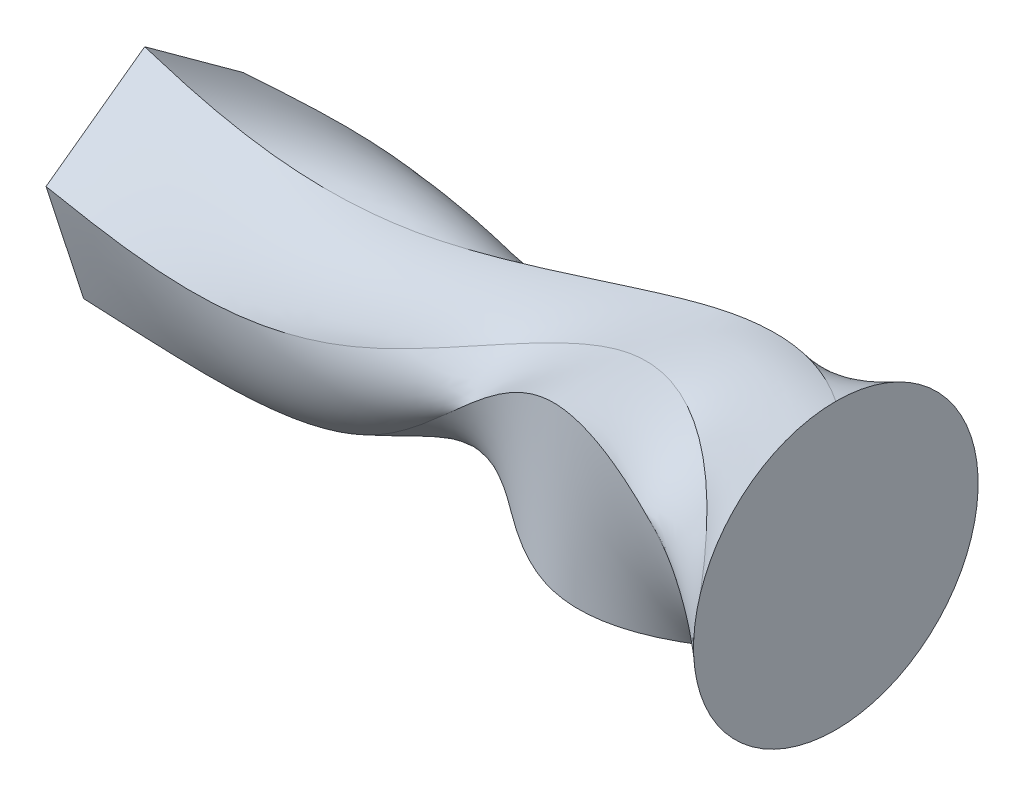
ISO-10303-21;
HEADER;
FILE_DESCRIPTION(('STEP AP214'),'2;1');
FILE_NAME('part.step','',(''),(''),'','','');
FILE_SCHEMA(('AUTOMOTIVE_DESIGN { 1 0 10303 214 1 1 1 1 }'));
ENDSEC;
DATA;
#1=APPLICATION_CONTEXT('core data for automotive mechanical design processes');
#2=APPLICATION_PROTOCOL_DEFINITION('international standard','automotive_design',2000,#1);
#3=PRODUCT_CONTEXT('',#1,'mechanical');
#4=PRODUCT('Part','Part','',(#3));
#5=PRODUCT_RELATED_PRODUCT_CATEGORY('part','',(#4));
#6=PRODUCT_DEFINITION_FORMATION('','',#4);
#7=PRODUCT_DEFINITION_CONTEXT('part definition',#1,'design');
#8=PRODUCT_DEFINITION('design','',#6,#7);
#9=PRODUCT_DEFINITION_SHAPE('','',#8);
#10=(LENGTH_UNIT() NAMED_UNIT(*) SI_UNIT(.MILLI.,.METRE.));
#11=(NAMED_UNIT(*) PLANE_ANGLE_UNIT() SI_UNIT($,.RADIAN.));
#12=(NAMED_UNIT(*) SI_UNIT($,.STERADIAN.) SOLID_ANGLE_UNIT());
#13=UNCERTAINTY_MEASURE_WITH_UNIT(LENGTH_MEASURE(1.E-05),#10,'distance_accuracy_value','');
#14=(GEOMETRIC_REPRESENTATION_CONTEXT(3) GLOBAL_UNCERTAINTY_ASSIGNED_CONTEXT((#13)) GLOBAL_UNIT_ASSIGNED_CONTEXT((#10,
#11,#12)) REPRESENTATION_CONTEXT('',''));
#15=CARTESIAN_POINT('',(0.,0.,0.));
#16=DIRECTION('',(0.,0.,1.));
#17=DIRECTION('',(1.,0.,0.));
#18=AXIS2_PLACEMENT_3D('',#15,#16,#17);
#19=CARTESIAN_POINT('',(431.8,0.,0.));
#20=DIRECTION('',(1.,0.,0.));
#21=DIRECTION('',(0.,0.,-1.));
#22=AXIS2_PLACEMENT_3D('',#19,#20,#21);
#23=PLANE('',#22);
#24=CARTESIAN_POINT('',(431.8,0.,0.));
#25=DIRECTION('',(1.,0.,0.));
#26=DIRECTION('',(0.,0.,-1.));
#27=AXIS2_PLACEMENT_3D('',#24,#25,#26);
#28=CIRCLE('',#27,88.9);
#29=CARTESIAN_POINT('',(431.8,-71.9216107999328,52.2541089288009));
#30=VERTEX_POINT('',#29);
#31=CARTESIAN_POINT('',(431.8,-71.9216107999328,-52.2541089288008));
#32=VERTEX_POINT('',#31);
#33=EDGE_CURVE('E12',#30,#32,#28,.T.);
#34=ORIENTED_EDGE('',*,*,#33,.T.);
#35=CARTESIAN_POINT('',(431.8,27.4716107999328,-84.5489242986392));
#36=VERTEX_POINT('',#35);
#37=EDGE_CURVE('E80',#32,#36,#28,.T.);
#38=ORIENTED_EDGE('',*,*,#37,.T.);
#39=CARTESIAN_POINT('',(431.8,88.9,0.));
#40=VERTEX_POINT('',#39);
#41=EDGE_CURVE('E310',#36,#40,#28,.T.);
#42=ORIENTED_EDGE('',*,*,#41,.T.);
#43=CARTESIAN_POINT('',(431.8,27.4716107999328,84.5489242986392));
#44=VERTEX_POINT('',#43);
#45=EDGE_CURVE('E148',#40,#44,#28,.T.);
#46=ORIENTED_EDGE('',*,*,#45,.T.);
#47=EDGE_CURVE('E300',#44,#30,#28,.T.);
#48=ORIENTED_EDGE('',*,*,#47,.T.);
#49=EDGE_LOOP('',(#34,#38,#42,#46,#48));
#50=FACE_BOUND('',#49,.T.);
#51=ADVANCED_FACE('F70',(#50),#23,.T.);
#52=CARTESIAN_POINT('',(0.,0.,0.));
#53=DIRECTION('',(1.,0.,0.));
#54=DIRECTION('',(0.,0.,-1.));
#55=AXIS2_PLACEMENT_3D('',#52,#53,#54);
#56=PLANE('',#55);
#57=DIRECTION('',(0.,0.587785252292473,0.809016994374948));
#58=VECTOR('',#57,1.);
#59=CARTESIAN_POINT('',(0.,20.030355371739,-61.647094971371));
#60=LINE('',#59,#58);
#61=CARTESIAN_POINT('',(0.,20.030355371739,-61.647094971371));
#62=VERTEX_POINT('',#61);
#63=CARTESIAN_POINT('',(0.,64.8195915964254,0.));
#64=VERTEX_POINT('',#63);
#65=EDGE_CURVE('E122',#62,#64,#60,.T.);
#66=ORIENTED_EDGE('',*,*,#65,.F.);
#67=DIRECTION('',(0.,0.951056516295154,-0.309016994374947));
#68=VECTOR('',#67,1.);
#69=CARTESIAN_POINT('',(0.,-52.4401511699517,-38.1));
#70=LINE('',#69,#68);
#71=CARTESIAN_POINT('',(0.,-52.4401511699517,-38.1));
#72=VERTEX_POINT('',#71);
#73=EDGE_CURVE('E247',#72,#62,#70,.T.);
#74=ORIENTED_EDGE('',*,*,#73,.F.);
#75=DIRECTION('',(0.,0.,-1.));
#76=VECTOR('',#75,1.);
#77=CARTESIAN_POINT('',(0.,-52.4401511699517,38.1));
#78=LINE('',#77,#76);
#79=CARTESIAN_POINT('',(0.,-52.4401511699517,38.1));
#80=VERTEX_POINT('',#79);
#81=EDGE_CURVE('E260',#80,#72,#78,.T.);
#82=ORIENTED_EDGE('',*,*,#81,.F.);
#83=DIRECTION('',(0.,-0.951056516295154,-0.309016994374947));
#84=VECTOR('',#83,1.);
#85=CARTESIAN_POINT('',(0.,20.030355371739,61.647094971371));
#86=LINE('',#85,#84);
#87=CARTESIAN_POINT('',(0.,20.030355371739,61.647094971371));
#88=VERTEX_POINT('',#87);
#89=EDGE_CURVE('E125',#88,#80,#86,.T.);
#90=ORIENTED_EDGE('',*,*,#89,.F.);
#91=DIRECTION('',(0.,-0.587785252292473,0.809016994374947));
#92=VECTOR('',#91,1.);
#93=CARTESIAN_POINT('',(0.,64.8195915964254,0.));
#94=LINE('',#93,#92);
#95=EDGE_CURVE('E118',#64,#88,#94,.T.);
#96=ORIENTED_EDGE('',*,*,#95,.F.);
#97=EDGE_LOOP('',(#66,#74,#82,#90,#96));
#98=FACE_BOUND('',#97,.T.);
#99=ADVANCED_FACE('F121',(#98),#56,.F.);
#100=CARTESIAN_POINT('',(0.,-52.4401511699517,-38.1));
#101=CARTESIAN_POINT('',(63.157552240822,-45.1767404083597,-48.7575966962876));
#102=CARTESIAN_POINT('',(170.43557150535,-36.6230282126755,-68.3392242639367));
#103=CARTESIAN_POINT('',(309.671415473656,-50.0605976745524,99.2944748248994));
#104=CARTESIAN_POINT('',(392.332751141102,-63.3256015046618,12.4634976771245));
#105=CARTESIAN_POINT('',(431.8,-71.9216107999328,-52.2541089288008));
#106=CARTESIAN_POINT('',(0.,-28.2833156560548,-45.9490316571237));
#107=CARTESIAN_POINT('',(62.7392988216526,-20.0171139687188,-50.7628943660321));
#108=CARTESIAN_POINT('',(170.539850739317,-21.3911295843357,-86.0364199282291));
#109=CARTESIAN_POINT('',(309.774504059735,-55.5571404338784,65.9547603601721));
#110=CARTESIAN_POINT('',(391.984307209305,-60.27072481648,-34.8587722640083));
#111=CARTESIAN_POINT('',(431.8,-49.289924538566,-83.403952728722));
#112=CARTESIAN_POINT('',(0.,-4.1264801421579,-53.7980633142473));
#113=CARTESIAN_POINT('',(62.3210454024832,5.14251247092208,-52.7681920357765));
#114=CARTESIAN_POINT('',(170.644129973283,15.0793511927085,-81.772552005885));
#115=CARTESIAN_POINT('',(309.877592645814,-73.7663371123298,19.4699404868973));
#116=CARTESIAN_POINT('',(391.635863277508,-39.7048366447819,-64.0743515624569));
#117=CARTESIAN_POINT('',(431.8,-9.14722679368276,-96.4471058859588));
#118=CARTESIAN_POINT('',(0.,20.030355371739,-61.647094971371));
#119=CARTESIAN_POINT('',(61.9027919833138,30.302138910563,-54.773489705521));
#120=CARTESIAN_POINT('',(170.74840920725,47.2758473759047,-47.2580850607923));
#121=CARTESIAN_POINT('',(309.980681231893,-89.4172798255757,-45.1218035459024));
#122=CARTESIAN_POINT('',(391.287419345711,-22.6628086243514,-68.348596116349));
#123=CARTESIAN_POINT('',(431.8,27.4716107999328,-84.5489242986392));
#124=B_SPLINE_SURFACE_WITH_KNOTS('',3,3,((#100,#101,#102,#103,#104,#105),(#106,#107,#108,#109,
#110,#111),(#112,#113,#114,#115,#116,#117),(#118,#119,#120,#121,#122,#123)),.UNSPECIFIED.,.F.,
.F.,.F.,(4,4),(4,1,1,4),(0.,1.),(0.,0.372499209937848,0.67262477173628,1.),.UNSPECIFIED.);
#125=CARTESIAN_POINT('',(0.,20.030355371739,-61.647094971371));
#126=CARTESIAN_POINT('',(61.9027919833138,30.302138910563,-54.773489705521));
#127=CARTESIAN_POINT('',(170.74840920725,47.2758473759047,-47.2580850607923));
#128=CARTESIAN_POINT('',(309.980681231893,-89.4172798255757,-45.1218035459024));
#129=CARTESIAN_POINT('',(391.287419345711,-22.6628086243514,-68.348596116349));
#130=CARTESIAN_POINT('',(431.8,27.4716107999328,-84.5489242986392));
#131=B_SPLINE_CURVE_WITH_KNOTS('',3,(#125,#126,#127,#128,#129,#130),.UNSPECIFIED.,.F.,.F.,(4,1,
1,4),(0.,0.372499209937848,0.67262477173628,1.),.UNSPECIFIED.);
#132=EDGE_CURVE('E141',#62,#36,#131,.T.);
#133=CARTESIAN_POINT('',(0.,-52.4401511699517,-38.1));
#134=CARTESIAN_POINT('',(63.157552240822,-45.1767404083597,-48.7575966962876));
#135=CARTESIAN_POINT('',(170.43557150535,-36.6230282126755,-68.3392242639367));
#136=CARTESIAN_POINT('',(309.671415473656,-50.0605976745524,99.2944748248994));
#137=CARTESIAN_POINT('',(392.332751141102,-63.3256015046618,12.4634976771245));
#138=CARTESIAN_POINT('',(431.8,-71.9216107999328,-52.2541089288008));
#139=B_SPLINE_CURVE_WITH_KNOTS('',3,(#133,#134,#135,#136,#137,#138),.UNSPECIFIED.,.F.,.F.,(4,1,
1,4),(0.,0.372499209937848,0.67262477173628,1.),.UNSPECIFIED.);
#140=EDGE_CURVE('E154',#32,#72,#139,.F.);
#141=ORIENTED_EDGE('',*,*,#73,.T.);
#142=ORIENTED_EDGE('',*,*,#132,.T.);
#143=ORIENTED_EDGE('',*,*,#37,.F.);
#144=ORIENTED_EDGE('',*,*,#140,.T.);
#145=EDGE_LOOP('',(#141,#142,#143,#144));
#146=FACE_BOUND('',#145,.T.);
#147=ADVANCED_FACE('F215',(#146),#124,.T.);
#148=CARTESIAN_POINT('',(0.,20.030355371739,-61.647094971371));
#149=CARTESIAN_POINT('',(61.9027919833138,30.302138910563,-54.773489705521));
#150=CARTESIAN_POINT('',(170.74840920725,47.2758473759047,-47.2580850607923));
#151=CARTESIAN_POINT('',(309.980681231893,-89.4172798255757,-45.1218035459024));
#152=CARTESIAN_POINT('',(391.287419345711,-22.6628086243514,-68.348596116349));
#153=CARTESIAN_POINT('',(431.8,27.4716107999328,-84.5489242986391));
#154=CARTESIAN_POINT('',(0.,34.9601007799678,-41.0980633142473));
#155=CARTESIAN_POINT('',(61.5279332254698,39.5779938186371,-33.3070421579278));
#156=CARTESIAN_POINT('',(170.844199161587,68.0599640705049,-43.2490702652751));
#157=CARTESIAN_POINT('',(310.066358377034,-56.8431004525541,-44.4369498616716));
#158=CARTESIAN_POINT('',(390.991015233462,24.3640791278072,-73.1394128120149));
#159=CARTESIAN_POINT('',(431.8,64.0904483935484,-72.6507427113194));
#160=CARTESIAN_POINT('',(0.,49.8898461881966,-20.5490316571237));
#161=CARTESIAN_POINT('',(61.1530744676259,48.8538487267111,-11.8405946103346));
#162=CARTESIAN_POINT('',(170.939989115924,74.5209509566401,-12.254621657543));
#163=CARTESIAN_POINT('',(310.152035522175,-15.6956090279637,-59.9046094907211));
#164=CARTESIAN_POINT('',(390.694611121213,59.5816808928018,-55.6809928088839));
#165=CARTESIAN_POINT('',(431.8,88.9,-38.5033244252029));
#166=CARTESIAN_POINT('',(0.,64.8195915964255,0.));
#167=CARTESIAN_POINT('',(60.778215709782,58.1297036347852,9.62585293725858));
#168=CARTESIAN_POINT('',(171.035779070261,50.8911746471628,24.0229752397162));
#169=CARTESIAN_POINT('',(310.237712667316,43.4631345597806,-78.5345722969758));
#170=CARTESIAN_POINT('',(390.398207008965,69.9897310513447,-33.8666666666667));
#171=CARTESIAN_POINT('',(431.8,88.9,0.));
#172=B_SPLINE_SURFACE_WITH_KNOTS('',3,3,((#148,#149,#150,#151,#152,#153),(#154,#155,#156,#157,
#158,#159),(#160,#161,#162,#163,#164,#165),(#166,#167,#168,#169,#170,#171)),.UNSPECIFIED.,.F.,
.F.,.F.,(4,4),(4,1,1,4),(0.,1.),(0.,0.372499209937848,0.67262477173628,1.),.UNSPECIFIED.);
#173=CARTESIAN_POINT('',(0.,64.8195915964255,0.));
#174=CARTESIAN_POINT('',(60.778215709782,58.1297036347852,9.62585293725858));
#175=CARTESIAN_POINT('',(171.035779070261,50.8911746471628,24.0229752397162));
#176=CARTESIAN_POINT('',(310.237712667316,43.4631345597806,-78.5345722969758));
#177=CARTESIAN_POINT('',(390.398207008965,69.9897310513447,-33.8666666666667));
#178=CARTESIAN_POINT('',(431.8,88.9,0.));
#179=B_SPLINE_CURVE_WITH_KNOTS('',3,(#173,#174,#175,#176,#177,#178),.UNSPECIFIED.,.F.,.F.,(4,1,
1,4),(0.,0.372499209937848,0.67262477173628,1.),.UNSPECIFIED.);
#180=EDGE_CURVE('E139',#64,#40,#179,.T.);
#181=ORIENTED_EDGE('',*,*,#65,.T.);
#182=ORIENTED_EDGE('',*,*,#180,.T.);
#183=ORIENTED_EDGE('',*,*,#41,.F.);
#184=ORIENTED_EDGE('',*,*,#132,.F.);
#185=EDGE_LOOP('',(#181,#182,#183,#184));
#186=FACE_BOUND('',#185,.T.);
#187=ADVANCED_FACE('F138',(#186),#172,.T.);
#188=CARTESIAN_POINT('',(0.,-52.4401511699517,38.1));
#189=CARTESIAN_POINT('',(64.4045704446777,-63.2129510747685,30.3509620906111));
#190=CARTESIAN_POINT('',(170.133498702076,-85.1400827538422,19.9935493712017));
#191=CARTESIAN_POINT('',(309.338592722405,107.19336779407,57.8230059545401));
#192=CARTESIAN_POINT('',(393.431878035752,4.27434997815971,55.3667432430697));
#193=CARTESIAN_POINT('',(431.8,-71.9216107999328,52.2541089288009));
#194=CARTESIAN_POINT('',(0.,-52.4401511699517,12.7));
#195=CARTESIAN_POINT('',(63.9888977100592,-57.2008808526322,3.98144249497823));
#196=CARTESIAN_POINT('',(170.234189636501,-96.417026689341,-4.97979181165249));
#197=CARTESIAN_POINT('',(309.449533639489,71.205543565332,68.9706984496272));
#198=CARTESIAN_POINT('',(393.065502404202,-40.8906534441476,44.7518902070341));
#199=CARTESIAN_POINT('',(431.8,-94.5532970612996,21.1042651288797));
#200=CARTESIAN_POINT('',(0.,-52.4401511699517,-12.7));
#201=CARTESIAN_POINT('',(63.5732249754406,-51.188810630496,-22.3880771006547));
#202=CARTESIAN_POINT('',(170.334880570925,-80.2446751756188,-43.3658830810824));
#203=CARTESIAN_POINT('',(309.560474556572,18.7875550757912,88.1467823298123));
#204=CARTESIAN_POINT('',(392.699126772652,-63.4239706050881,23.0783507131602));
#205=CARTESIAN_POINT('',(431.8,-94.5532970612997,-21.1042651288797));
#206=CARTESIAN_POINT('',(0.,-52.4401511699517,-38.1));
#207=CARTESIAN_POINT('',(63.157552240822,-45.1767404083597,-48.7575966962875));
#208=CARTESIAN_POINT('',(170.43557150535,-36.6230282126755,-68.3392242639367));
#209=CARTESIAN_POINT('',(309.671415473656,-50.0605976745524,99.2944748248994));
#210=CARTESIAN_POINT('',(392.332751141102,-63.3256015046618,12.4634976771245));
#211=CARTESIAN_POINT('',(431.8,-71.9216107999328,-52.2541089288008));
#212=B_SPLINE_SURFACE_WITH_KNOTS('',3,3,((#188,#189,#190,#191,#192,#193),(#194,#195,#196,#197,
#198,#199),(#200,#201,#202,#203,#204,#205),(#206,#207,#208,#209,#210,#211)),.UNSPECIFIED.,.F.,
.F.,.F.,(4,4),(4,1,1,4),(0.,1.),(0.,0.372499209937848,0.67262477173628,1.),.UNSPECIFIED.);
#213=CARTESIAN_POINT('',(0.,-52.4401511699517,38.1));
#214=CARTESIAN_POINT('',(64.4045704446777,-63.2129510747685,30.3509620906111));
#215=CARTESIAN_POINT('',(170.133498702076,-85.1400827538422,19.9935493712017));
#216=CARTESIAN_POINT('',(309.338592722405,107.19336779407,57.8230059545401));
#217=CARTESIAN_POINT('',(393.431878035752,4.2743499781597,55.3667432430698));
#218=CARTESIAN_POINT('',(431.8,-71.9216107999328,52.2541089288009));
#219=B_SPLINE_CURVE_WITH_KNOTS('',3,(#213,#214,#215,#216,#217,#218),.UNSPECIFIED.,.F.,.F.,(4,1,
1,4),(0.,0.372499209937848,0.67262477173628,1.),.UNSPECIFIED.);
#220=EDGE_CURVE('E152',#80,#30,#219,.T.);
#221=ORIENTED_EDGE('',*,*,#81,.T.);
#222=ORIENTED_EDGE('',*,*,#140,.F.);
#223=ORIENTED_EDGE('',*,*,#33,.F.);
#224=ORIENTED_EDGE('',*,*,#220,.F.);
#225=EDGE_LOOP('',(#221,#222,#223,#224));
#226=FACE_BOUND('',#225,.T.);
#227=ADVANCED_FACE('F182',(#226),#212,.T.);
#228=CARTESIAN_POINT('',(0.,64.8195915964255,0.));
#229=CARTESIAN_POINT('',(60.778215709782,58.1297036347852,9.62585293725858));
#230=CARTESIAN_POINT('',(171.035779070261,50.8911746471628,24.0229752397162));
#231=CARTESIAN_POINT('',(310.237712667316,43.4631345597806,-78.5345722969758));
#232=CARTESIAN_POINT('',(390.398207008965,69.9897310513447,-33.8666666666667));
#233=CARTESIAN_POINT('',(431.8,88.9,0.));
#234=CARTESIAN_POINT('',(0.,49.8898461881966,20.5490316571237));
#235=CARTESIAN_POINT('',(60.9959167037522,42.5457012345885,27.8529922049012));
#236=CARTESIAN_POINT('',(171.03880978428,58.4669835223868,52.3100838289892));
#237=CARTESIAN_POINT('',(310.018868749611,36.6668969355539,-71.0062156745301));
#238=CARTESIAN_POINT('',(390.970365716149,82.1722405989964,-0.724112904898715));
#239=CARTESIAN_POINT('',(431.8,88.9,38.5033244252029));
#240=CARTESIAN_POINT('',(0.,34.9601007799678,41.0980633142473));
#241=CARTESIAN_POINT('',(61.2136176977225,26.9616988343919,46.0801314725438));
#242=CARTESIAN_POINT('',(171.041840498298,35.9520292019983,75.314044128735));
#243=CARTESIAN_POINT('',(309.800024831906,47.8819114744812,-60.3155558748794));
#244=CARTESIAN_POINT('',(391.542524423333,69.5451985401964,28.0625347177829));
#245=CARTESIAN_POINT('',(431.8,64.0904483935484,72.6507427113195));
#246=CARTESIAN_POINT('',(0.,20.030355371739,61.647094971371));
#247=CARTESIAN_POINT('',(61.4313186916927,11.3776964341952,64.3072707401865));
#248=CARTESIAN_POINT('',(171.044871212317,-0.886054926855206,71.332570616266));
#249=CARTESIAN_POINT('',(309.581180914201,67.6702380649773,-33.4723827619482));
#250=CARTESIAN_POINT('',(392.114683130518,45.1088704942324,34.5999456416676));
#251=CARTESIAN_POINT('',(431.8,27.4716107999328,84.5489242986392));
#252=B_SPLINE_SURFACE_WITH_KNOTS('',3,3,((#228,#229,#230,#231,#232,#233),(#234,#235,#236,#237,
#238,#239),(#240,#241,#242,#243,#244,#245),(#246,#247,#248,#249,#250,#251)),.UNSPECIFIED.,.F.,
.F.,.F.,(4,4),(4,1,1,4),(0.,1.),(0.,0.372499209937848,0.67262477173628,1.),.UNSPECIFIED.);
#253=CARTESIAN_POINT('',(0.,20.030355371739,61.647094971371));
#254=CARTESIAN_POINT('',(61.4313186916927,11.3776964341952,64.3072707401865));
#255=CARTESIAN_POINT('',(171.044871212317,-0.886054926855206,71.332570616266));
#256=CARTESIAN_POINT('',(309.581180914201,67.6702380649773,-33.4723827619482));
#257=CARTESIAN_POINT('',(392.114683130518,45.1088704942324,34.5999456416676));
#258=CARTESIAN_POINT('',(431.8,27.4716107999328,84.5489242986392));
#259=B_SPLINE_CURVE_WITH_KNOTS('',3,(#253,#254,#255,#256,#257,#258),.UNSPECIFIED.,.F.,.F.,(4,1,
1,4),(0.,0.372499209937848,0.67262477173628,1.),.UNSPECIFIED.);
#260=EDGE_CURVE('E150',#88,#44,#259,.T.);
#261=ORIENTED_EDGE('',*,*,#95,.T.);
#262=ORIENTED_EDGE('',*,*,#260,.T.);
#263=ORIENTED_EDGE('',*,*,#45,.F.);
#264=ORIENTED_EDGE('',*,*,#180,.F.);
#265=EDGE_LOOP('',(#261,#262,#263,#264));
#266=FACE_BOUND('',#265,.T.);
#267=ADVANCED_FACE('F147',(#266),#252,.T.);
#268=CARTESIAN_POINT('',(0.,20.030355371739,61.647094971371));
#269=CARTESIAN_POINT('',(61.4313186916927,11.3776964341952,64.3072707401865));
#270=CARTESIAN_POINT('',(171.044871212317,-0.886054926855206,71.332570616266));
#271=CARTESIAN_POINT('',(309.581180914201,67.6702380649773,-33.4723827619482));
#272=CARTESIAN_POINT('',(392.114683130518,45.1088704942324,34.5999456416676));
#273=CARTESIAN_POINT('',(431.8,27.4716107999328,84.5489242986392));
#274=CARTESIAN_POINT('',(0.,-4.12648014215792,53.7980633142473));
#275=CARTESIAN_POINT('',(62.4224026093544,-13.4858527354594,52.988501190328));
#276=CARTESIAN_POINT('',(170.74108037557,-33.2009351895203,81.7069840786224));
#277=CARTESIAN_POINT('',(309.500318183602,83.3766633042463,-19.4935710989846));
#278=CARTESIAN_POINT('',(392.553748098929,28.0095999285478,64.1853315527341));
#279=CARTESIAN_POINT('',(431.8,-9.14722679368275,96.4471058859588));
#280=CARTESIAN_POINT('',(0.,-28.2833156560548,45.9490316571237));
#281=CARTESIAN_POINT('',(63.413486527016,-38.3494019051139,41.6697316404696));
#282=CARTESIAN_POINT('',(170.437289538823,-69.7898000460335,61.8307985182304));
#283=CARTESIAN_POINT('',(309.419455453004,101.641342508721,12.592164723504));
#284=CARTESIAN_POINT('',(392.99281306734,7.38646921159555,68.8293827192441));
#285=CARTESIAN_POINT('',(431.8,-49.289924538566,83.403952728722));
#286=CARTESIAN_POINT('',(0.,-52.4401511699517,38.1));
#287=CARTESIAN_POINT('',(64.4045704446777,-63.2129510747685,30.3509620906111));
#288=CARTESIAN_POINT('',(170.133498702076,-85.1400827538422,19.9935493712017));
#289=CARTESIAN_POINT('',(309.338592722405,107.19336779407,57.8230059545401));
#290=CARTESIAN_POINT('',(393.431878035752,4.2743499781597,55.3667432430698));
#291=CARTESIAN_POINT('',(431.8,-71.9216107999328,52.2541089288009));
#292=B_SPLINE_SURFACE_WITH_KNOTS('',3,3,((#268,#269,#270,#271,#272,#273),(#274,#275,#276,#277,
#278,#279),(#280,#281,#282,#283,#284,#285),(#286,#287,#288,#289,#290,#291)),.UNSPECIFIED.,.F.,
.F.,.F.,(4,4),(4,1,1,4),(0.,1.),(0.,0.372499209937848,0.67262477173628,1.),.UNSPECIFIED.);
#293=ORIENTED_EDGE('',*,*,#89,.T.);
#294=ORIENTED_EDGE('',*,*,#220,.T.);
#295=ORIENTED_EDGE('',*,*,#47,.F.);
#296=ORIENTED_EDGE('',*,*,#260,.F.);
#297=EDGE_LOOP('',(#293,#294,#295,#296));
#298=FACE_BOUND('',#297,.T.);
#299=ADVANCED_FACE('F181',(#298),#292,.T.);
#300=CLOSED_SHELL('',(#51,#99,#147,#187,#227,#267,#299));
#301=MANIFOLD_SOLID_BREP('B2',#300);
#302=ADVANCED_BREP_SHAPE_REPRESENTATION('',(#18,#301),#14);
#303=SHAPE_DEFINITION_REPRESENTATION(#9,#302);
ENDSEC;
END-ISO-10303-21;
